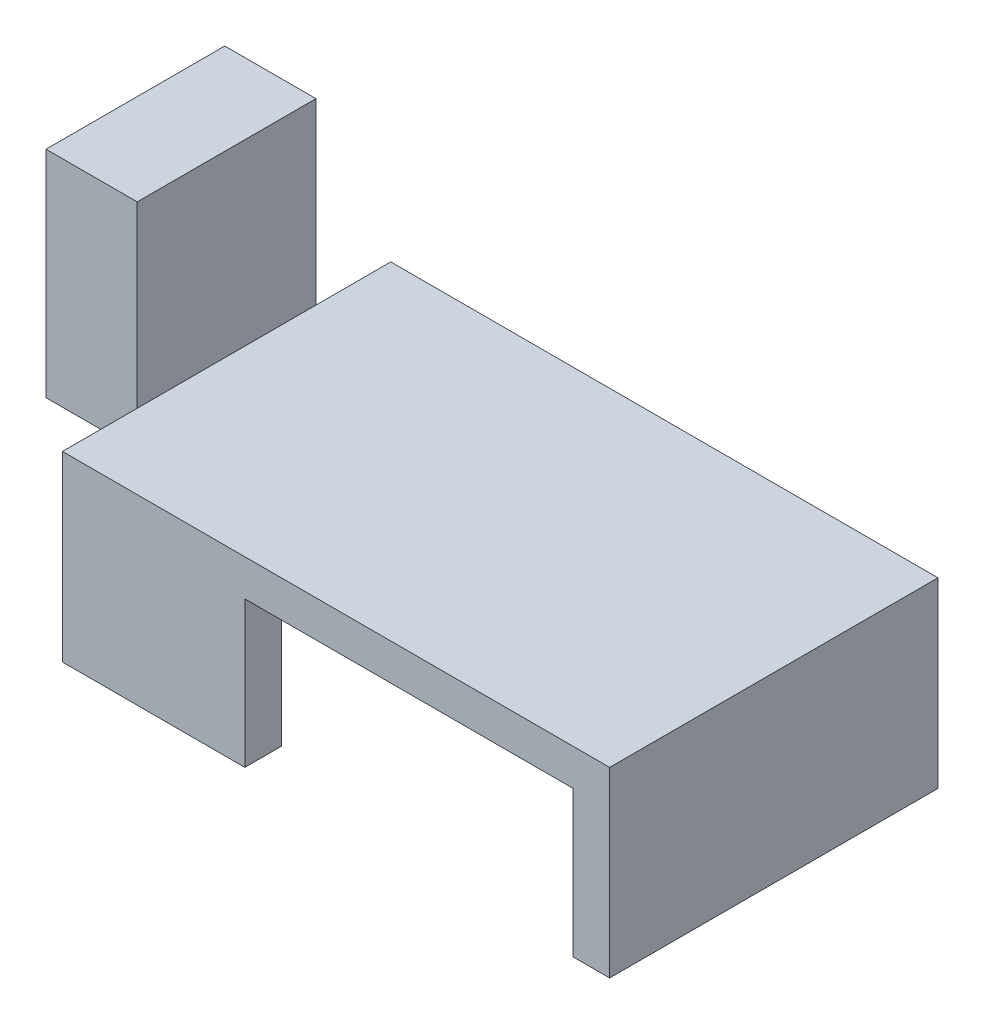
ISO-10303-21;
HEADER;
FILE_DESCRIPTION(('STEP AP214'),'2;1');
FILE_NAME('part.step','',(''),(''),'','','');
FILE_SCHEMA(('AUTOMOTIVE_DESIGN { 1 0 10303 214 1 1 1 1 }'));
ENDSEC;
DATA;
#1=APPLICATION_CONTEXT('core data for automotive mechanical design processes');
#2=APPLICATION_PROTOCOL_DEFINITION('international standard','automotive_design',2000,#1);
#3=PRODUCT_CONTEXT('',#1,'mechanical');
#4=PRODUCT('Part','Part','',(#3));
#5=PRODUCT_RELATED_PRODUCT_CATEGORY('part','',(#4));
#6=PRODUCT_DEFINITION_FORMATION('','',#4);
#7=PRODUCT_DEFINITION_CONTEXT('part definition',#1,'design');
#8=PRODUCT_DEFINITION('design','',#6,#7);
#9=PRODUCT_DEFINITION_SHAPE('','',#8);
#10=(LENGTH_UNIT() NAMED_UNIT(*) SI_UNIT(.MILLI.,.METRE.));
#11=(NAMED_UNIT(*) PLANE_ANGLE_UNIT() SI_UNIT($,.RADIAN.));
#12=(NAMED_UNIT(*) SI_UNIT($,.STERADIAN.) SOLID_ANGLE_UNIT());
#13=UNCERTAINTY_MEASURE_WITH_UNIT(LENGTH_MEASURE(1.E-05),#10,'distance_accuracy_value','');
#14=(GEOMETRIC_REPRESENTATION_CONTEXT(3) GLOBAL_UNCERTAINTY_ASSIGNED_CONTEXT((#13)) GLOBAL_UNIT_ASSIGNED_CONTEXT((#10,
#11,#12)) REPRESENTATION_CONTEXT('',''));
#15=CARTESIAN_POINT('',(0.,0.,0.));
#16=DIRECTION('',(0.,0.,1.));
#17=DIRECTION('',(1.,0.,0.));
#18=AXIS2_PLACEMENT_3D('',#15,#16,#17);
#19=CARTESIAN_POINT('',(9.00000000000001,-8.,-7.));
#20=DIRECTION('',(0.,0.,-1.));
#21=DIRECTION('',(-1.,0.,0.));
#22=AXIS2_PLACEMENT_3D('',#19,#20,#21);
#23=PLANE('',#22);
#24=DIRECTION('',(0.,-1.,0.));
#25=VECTOR('',#24,1.);
#26=CARTESIAN_POINT('',(1.,-8.,-6.99999999999999));
#27=LINE('',#26,#25);
#28=CARTESIAN_POINT('',(1.,0.,-6.99999999999999));
#29=VERTEX_POINT('',#28);
#30=CARTESIAN_POINT('',(1.,-8.,-7.));
#31=VERTEX_POINT('',#30);
#32=EDGE_CURVE('E54',#29,#31,#27,.T.);
#33=ORIENTED_EDGE('',*,*,#32,.F.);
#34=DIRECTION('',(-1.,0.,0.));
#35=VECTOR('',#34,1.);
#36=CARTESIAN_POINT('',(9.00000000000001,0.,-7.));
#37=LINE('',#36,#35);
#38=CARTESIAN_POINT('',(-9.,0.,-7.));
#39=VERTEX_POINT('',#38);
#40=EDGE_CURVE('E175',#29,#39,#37,.T.);
#41=ORIENTED_EDGE('',*,*,#40,.T.);
#42=DIRECTION('',(0.,1.,0.));
#43=VECTOR('',#42,1.);
#44=CARTESIAN_POINT('',(-9.,0.,-7.));
#45=LINE('',#44,#43);
#46=CARTESIAN_POINT('',(-9.,-8.,-7.));
#47=VERTEX_POINT('',#46);
#48=EDGE_CURVE('E197',#47,#39,#45,.T.);
#49=ORIENTED_EDGE('',*,*,#48,.F.);
#50=DIRECTION('',(-1.,0.,0.));
#51=VECTOR('',#50,1.);
#52=CARTESIAN_POINT('',(9.00000000000001,-8.,-7.));
#53=LINE('',#52,#51);
#54=EDGE_CURVE('E278',#31,#47,#53,.T.);
#55=ORIENTED_EDGE('',*,*,#54,.F.);
#56=EDGE_LOOP('',(#33,#41,#49,#55));
#57=FACE_BOUND('',#56,.T.);
#58=ADVANCED_FACE('F39',(#57),#23,.F.);
#59=CARTESIAN_POINT('',(0.,-8.,0.));
#60=DIRECTION('',(0.,-1.,0.));
#61=DIRECTION('',(0.,0.,-1.));
#62=AXIS2_PLACEMENT_3D('',#59,#60,#61);
#63=PLANE('',#62);
#64=DIRECTION('',(1.,0.,0.));
#65=VECTOR('',#64,1.);
#66=CARTESIAN_POINT('',(9.,-8.,-9.));
#67=LINE('',#66,#65);
#68=CARTESIAN_POINT('',(-9.,-8.,-9.));
#69=VERTEX_POINT('',#68);
#70=CARTESIAN_POINT('',(1.,-8.,-8.99999999999999));
#71=VERTEX_POINT('',#70);
#72=EDGE_CURVE('E168',#69,#71,#67,.T.);
#73=ORIENTED_EDGE('',*,*,#72,.T.);
#74=DIRECTION('',(0.,0.,-1.));
#75=VECTOR('',#74,1.);
#76=CARTESIAN_POINT('',(1.,-8.,-8.99999999999999));
#77=LINE('',#76,#75);
#78=EDGE_CURVE('E178',#31,#71,#77,.T.);
#79=ORIENTED_EDGE('',*,*,#78,.F.);
#80=ORIENTED_EDGE('',*,*,#54,.T.);
#81=DIRECTION('',(0.,0.,1.));
#82=VECTOR('',#81,1.);
#83=CARTESIAN_POINT('',(-9.,-8.,-9.));
#84=LINE('',#83,#82);
#85=EDGE_CURVE('E194',#69,#47,#84,.T.);
#86=ORIENTED_EDGE('',*,*,#85,.F.);
#87=EDGE_LOOP('',(#73,#79,#80,#86));
#88=FACE_BOUND('',#87,.T.);
#89=ADVANCED_FACE('F311',(#88),#63,.T.);
#90=CARTESIAN_POINT('',(-9.,-8.,7.));
#91=DIRECTION('',(0.,0.,1.));
#92=DIRECTION('',(1.,0.,0.));
#93=AXIS2_PLACEMENT_3D('',#90,#91,#92);
#94=PLANE('',#93);
#95=DIRECTION('',(0.,1.,0.));
#96=VECTOR('',#95,1.);
#97=CARTESIAN_POINT('',(1.,-8.,7.));
#98=LINE('',#97,#96);
#99=CARTESIAN_POINT('',(1.,-8.,7.));
#100=VERTEX_POINT('',#99);
#101=CARTESIAN_POINT('',(1.,0.,7.));
#102=VERTEX_POINT('',#101);
#103=EDGE_CURVE('E179',#100,#102,#98,.T.);
#104=ORIENTED_EDGE('',*,*,#103,.F.);
#105=DIRECTION('',(1.,0.,0.));
#106=VECTOR('',#105,1.);
#107=CARTESIAN_POINT('',(-9.,-8.,7.));
#108=LINE('',#107,#106);
#109=CARTESIAN_POINT('',(-9.,-8.,7.));
#110=VERTEX_POINT('',#109);
#111=EDGE_CURVE('E268',#110,#100,#108,.T.);
#112=ORIENTED_EDGE('',*,*,#111,.F.);
#113=DIRECTION('',(0.,-1.,0.));
#114=VECTOR('',#113,1.);
#115=CARTESIAN_POINT('',(-9.,-8.,7.));
#116=LINE('',#115,#114);
#117=CARTESIAN_POINT('',(-9.,0.,7.));
#118=VERTEX_POINT('',#117);
#119=EDGE_CURVE('E198',#118,#110,#116,.T.);
#120=ORIENTED_EDGE('',*,*,#119,.F.);
#121=DIRECTION('',(1.,0.,0.));
#122=VECTOR('',#121,1.);
#123=CARTESIAN_POINT('',(-9.,0.,7.));
#124=LINE('',#123,#122);
#125=EDGE_CURVE('E62',#118,#102,#124,.T.);
#126=ORIENTED_EDGE('',*,*,#125,.T.);
#127=EDGE_LOOP('',(#104,#112,#120,#126));
#128=FACE_BOUND('',#127,.T.);
#129=ADVANCED_FACE('F309',(#128),#94,.F.);
#130=CARTESIAN_POINT('',(0.,-8.,0.));
#131=DIRECTION('',(0.,-1.,0.));
#132=DIRECTION('',(0.,0.,-1.));
#133=AXIS2_PLACEMENT_3D('',#130,#131,#132);
#134=PLANE('',#133);
#135=ORIENTED_EDGE('',*,*,#111,.T.);
#136=DIRECTION('',(0.,0.,-1.));
#137=VECTOR('',#136,1.);
#138=CARTESIAN_POINT('',(1.,-8.,7.));
#139=LINE('',#138,#137);
#140=CARTESIAN_POINT('',(1.,-8.,9.00000000000001));
#141=VERTEX_POINT('',#140);
#142=EDGE_CURVE('E188',#141,#100,#139,.T.);
#143=ORIENTED_EDGE('',*,*,#142,.F.);
#144=DIRECTION('',(-1.,0.,0.));
#145=VECTOR('',#144,1.);
#146=CARTESIAN_POINT('',(-9.,-8.,9.));
#147=LINE('',#146,#145);
#148=CARTESIAN_POINT('',(-9.,-8.,9.));
#149=VERTEX_POINT('',#148);
#150=EDGE_CURVE('E271',#141,#149,#147,.T.);
#151=ORIENTED_EDGE('',*,*,#150,.T.);
#152=DIRECTION('',(0.,0.,1.));
#153=VECTOR('',#152,1.);
#154=CARTESIAN_POINT('',(-9.,-8.,9.));
#155=LINE('',#154,#153);
#156=EDGE_CURVE('E187',#110,#149,#155,.T.);
#157=ORIENTED_EDGE('',*,*,#156,.F.);
#158=EDGE_LOOP('',(#135,#143,#151,#157));
#159=FACE_BOUND('',#158,.T.);
#160=ADVANCED_FACE('F303',(#159),#134,.T.);
#161=CARTESIAN_POINT('',(0.,0.,0.));
#162=DIRECTION('',(0.,1.,0.));
#163=DIRECTION('',(0.,0.,1.));
#164=AXIS2_PLACEMENT_3D('',#161,#162,#163);
#165=PLANE('',#164);
#166=DIRECTION('',(0.,0.,1.));
#167=VECTOR('',#166,1.);
#168=CARTESIAN_POINT('',(1.,0.,-8.99999999999999));
#169=LINE('',#168,#167);
#170=CARTESIAN_POINT('',(1.,0.,-8.99999999999999));
#171=VERTEX_POINT('',#170);
#172=EDGE_CURVE('E172',#171,#29,#169,.T.);
#173=ORIENTED_EDGE('',*,*,#172,.F.);
#174=DIRECTION('',(-1.,0.,0.));
#175=VECTOR('',#174,1.);
#176=CARTESIAN_POINT('',(21.,0.,-9.));
#177=LINE('',#176,#175);
#178=CARTESIAN_POINT('',(19.,0.,-9.));
#179=VERTEX_POINT('',#178);
#180=EDGE_CURVE('E159',#179,#171,#177,.T.);
#181=ORIENTED_EDGE('',*,*,#180,.F.);
#182=DIRECTION('',(0.,0.,-1.));
#183=VECTOR('',#182,1.);
#184=CARTESIAN_POINT('',(19.,0.,7.));
#185=LINE('',#184,#183);
#186=CARTESIAN_POINT('',(19.,0.,9.));
#187=VERTEX_POINT('',#186);
#188=EDGE_CURVE('E249',#187,#179,#185,.T.);
#189=ORIENTED_EDGE('',*,*,#188,.F.);
#190=DIRECTION('',(1.,0.,0.));
#191=VECTOR('',#190,1.);
#192=CARTESIAN_POINT('',(-9.,0.,9.));
#193=LINE('',#192,#191);
#194=CARTESIAN_POINT('',(1.,0.,9.00000000000001));
#195=VERTEX_POINT('',#194);
#196=EDGE_CURVE('E208',#195,#187,#193,.T.);
#197=ORIENTED_EDGE('',*,*,#196,.F.);
#198=DIRECTION('',(0.,0.,1.));
#199=VECTOR('',#198,1.);
#200=CARTESIAN_POINT('',(1.,0.,7.));
#201=LINE('',#200,#199);
#202=EDGE_CURVE('E182',#102,#195,#201,.T.);
#203=ORIENTED_EDGE('',*,*,#202,.F.);
#204=ORIENTED_EDGE('',*,*,#125,.F.);
#205=DIRECTION('',(0.,0.,1.));
#206=VECTOR('',#205,1.);
#207=CARTESIAN_POINT('',(-9.,0.,-9.));
#208=LINE('',#207,#206);
#209=CARTESIAN_POINT('',(-9.,0.,4.9));
#210=VERTEX_POINT('',#209);
#211=EDGE_CURVE('E275',#210,#118,#208,.T.);
#212=ORIENTED_EDGE('',*,*,#211,.F.);
#213=DIRECTION('',(1.,0.,0.));
#214=VECTOR('',#213,1.);
#215=CARTESIAN_POINT('',(-14.,0.,4.9));
#216=LINE('',#215,#214);
#217=CARTESIAN_POINT('',(-14.,0.,4.9));
#218=VERTEX_POINT('',#217);
#219=EDGE_CURVE('E239',#218,#210,#216,.T.);
#220=ORIENTED_EDGE('',*,*,#219,.F.);
#221=DIRECTION('',(0.,0.,1.));
#222=VECTOR('',#221,1.);
#223=CARTESIAN_POINT('',(-14.,0.,-4.9));
#224=LINE('',#223,#222);
#225=CARTESIAN_POINT('',(-14.,0.,-4.9));
#226=VERTEX_POINT('',#225);
#227=EDGE_CURVE('E234',#226,#218,#224,.T.);
#228=ORIENTED_EDGE('',*,*,#227,.F.);
#229=DIRECTION('',(1.,0.,0.));
#230=VECTOR('',#229,1.);
#231=CARTESIAN_POINT('',(-14.,0.,-4.9));
#232=LINE('',#231,#230);
#233=CARTESIAN_POINT('',(-9.,0.,-4.9));
#234=VERTEX_POINT('',#233);
#235=EDGE_CURVE('E246',#226,#234,#232,.T.);
#236=ORIENTED_EDGE('',*,*,#235,.T.);
#237=EDGE_CURVE('E284',#39,#234,#208,.T.);
#238=ORIENTED_EDGE('',*,*,#237,.F.);
#239=ORIENTED_EDGE('',*,*,#40,.F.);
#240=EDGE_LOOP('',(#173,#181,#189,#197,#203,#204,#212,#220,#228,#236,#238,#239));
#241=FACE_BOUND('',#240,.T.);
#242=ADVANCED_FACE('F173',(#241),#165,.F.);
#243=CARTESIAN_POINT('',(21.,-8.,9.));
#244=VERTEX_POINT('',#243);
#245=CARTESIAN_POINT('',(19.,-8.,9.));
#246=VERTEX_POINT('',#245);
#247=EDGE_CURVE('E272',#244,#246,#147,.T.);
#248=ORIENTED_EDGE('',*,*,#247,.T.);
#249=DIRECTION('',(0.,0.,-1.));
#250=VECTOR('',#249,1.);
#251=CARTESIAN_POINT('',(19.,-8.,7.));
#252=LINE('',#251,#250);
#253=CARTESIAN_POINT('',(19.,-8.,-9.));
#254=VERTEX_POINT('',#253);
#255=EDGE_CURVE('E253',#246,#254,#252,.T.);
#256=ORIENTED_EDGE('',*,*,#255,.T.);
#257=DIRECTION('',(1.,0.,0.));
#258=VECTOR('',#257,1.);
#259=CARTESIAN_POINT('',(21.,-8.,-9.));
#260=LINE('',#259,#258);
#261=CARTESIAN_POINT('',(21.,-8.,-9.));
#262=VERTEX_POINT('',#261);
#263=EDGE_CURVE('E255',#254,#262,#260,.T.);
#264=ORIENTED_EDGE('',*,*,#263,.T.);
#265=DIRECTION('',(0.,0.,1.));
#266=VECTOR('',#265,1.);
#267=CARTESIAN_POINT('',(21.,-8.,9.));
#268=LINE('',#267,#266);
#269=EDGE_CURVE('E250',#262,#244,#268,.T.);
#270=ORIENTED_EDGE('',*,*,#269,.T.);
#271=EDGE_LOOP('',(#248,#256,#264,#270));
#272=FACE_BOUND('',#271,.T.);
#273=ADVANCED_FACE('F318',(#272),#134,.T.);
#274=CARTESIAN_POINT('',(-9.,2.,-9.));
#275=DIRECTION('',(1.,0.,0.));
#276=DIRECTION('',(0.,0.,-1.));
#277=AXIS2_PLACEMENT_3D('',#274,#275,#276);
#278=PLANE('',#277);
#279=DIRECTION('',(0.,-1.,0.));
#280=VECTOR('',#279,1.);
#281=CARTESIAN_POINT('',(-9.,2.,-9.));
#282=LINE('',#281,#280);
#283=CARTESIAN_POINT('',(-9.,2.,-9.));
#284=VERTEX_POINT('',#283);
#285=EDGE_CURVE('E11',#284,#69,#282,.T.);
#286=ORIENTED_EDGE('',*,*,#285,.T.);
#287=ORIENTED_EDGE('',*,*,#85,.T.);
#288=ORIENTED_EDGE('',*,*,#48,.T.);
#289=ORIENTED_EDGE('',*,*,#237,.T.);
#290=DIRECTION('',(0.,-1.,0.));
#291=VECTOR('',#290,1.);
#292=CARTESIAN_POINT('',(-9.,2.,-4.9));
#293=LINE('',#292,#291);
#294=CARTESIAN_POINT('',(-9.,2.,-4.9));
#295=VERTEX_POINT('',#294);
#296=EDGE_CURVE('E230',#295,#234,#293,.T.);
#297=ORIENTED_EDGE('',*,*,#296,.F.);
#298=DIRECTION('',(0.,0.,1.));
#299=VECTOR('',#298,1.);
#300=CARTESIAN_POINT('',(-9.,2.,-9.));
#301=LINE('',#300,#299);
#302=EDGE_CURVE('E285',#284,#295,#301,.T.);
#303=ORIENTED_EDGE('',*,*,#302,.F.);
#304=EDGE_LOOP('',(#286,#287,#288,#289,#297,#303));
#305=FACE_BOUND('',#304,.T.);
#306=ADVANCED_FACE('F336',(#305),#278,.F.);
#307=ORIENTED_EDGE('',*,*,#211,.T.);
#308=ORIENTED_EDGE('',*,*,#119,.T.);
#309=ORIENTED_EDGE('',*,*,#156,.T.);
#310=DIRECTION('',(0.,-1.,0.));
#311=VECTOR('',#310,1.);
#312=CARTESIAN_POINT('',(-9.,2.,9.));
#313=LINE('',#312,#311);
#314=CARTESIAN_POINT('',(-9.,2.,9.));
#315=VERTEX_POINT('',#314);
#316=EDGE_CURVE('E47',#315,#149,#313,.T.);
#317=ORIENTED_EDGE('',*,*,#316,.F.);
#318=CARTESIAN_POINT('',(-9.,2.,4.9));
#319=VERTEX_POINT('',#318);
#320=EDGE_CURVE('E283',#319,#315,#301,.T.);
#321=ORIENTED_EDGE('',*,*,#320,.F.);
#322=DIRECTION('',(0.,1.,0.));
#323=VECTOR('',#322,1.);
#324=CARTESIAN_POINT('',(-9.,2.,4.9));
#325=LINE('',#324,#323);
#326=EDGE_CURVE('E235',#210,#319,#325,.T.);
#327=ORIENTED_EDGE('',*,*,#326,.F.);
#328=EDGE_LOOP('',(#307,#308,#309,#317,#321,#327));
#329=FACE_BOUND('',#328,.T.);
#330=ADVANCED_FACE('F300',(#329),#278,.F.);
#331=CARTESIAN_POINT('',(-9.,2.,-9.));
#332=DIRECTION('',(0.,0.,1.));
#333=DIRECTION('',(1.,0.,0.));
#334=AXIS2_PLACEMENT_3D('',#331,#332,#333);
#335=PLANE('',#334);
#336=ORIENTED_EDGE('',*,*,#180,.T.);
#337=DIRECTION('',(0.,1.,0.));
#338=VECTOR('',#337,1.);
#339=CARTESIAN_POINT('',(1.,-8.,-8.99999999999999));
#340=LINE('',#339,#338);
#341=EDGE_CURVE('E163',#71,#171,#340,.T.);
#342=ORIENTED_EDGE('',*,*,#341,.F.);
#343=ORIENTED_EDGE('',*,*,#72,.F.);
#344=ORIENTED_EDGE('',*,*,#285,.F.);
#345=DIRECTION('',(-1.,0.,0.));
#346=VECTOR('',#345,1.);
#347=CARTESIAN_POINT('',(-9.,2.,-9.));
#348=LINE('',#347,#346);
#349=CARTESIAN_POINT('',(21.,2.,-9.));
#350=VERTEX_POINT('',#349);
#351=EDGE_CURVE('E281',#350,#284,#348,.T.);
#352=ORIENTED_EDGE('',*,*,#351,.F.);
#353=DIRECTION('',(0.,1.,0.));
#354=VECTOR('',#353,1.);
#355=CARTESIAN_POINT('',(21.,2.,-9.));
#356=LINE('',#355,#354);
#357=EDGE_CURVE('E263',#262,#350,#356,.T.);
#358=ORIENTED_EDGE('',*,*,#357,.F.);
#359=ORIENTED_EDGE('',*,*,#263,.F.);
#360=DIRECTION('',(0.,1.,0.));
#361=VECTOR('',#360,1.);
#362=CARTESIAN_POINT('',(19.,-8.,-9.));
#363=LINE('',#362,#361);
#364=EDGE_CURVE('E167',#254,#179,#363,.T.);
#365=ORIENTED_EDGE('',*,*,#364,.T.);
#366=EDGE_LOOP('',(#336,#342,#343,#344,#352,#358,#359,#365));
#367=FACE_BOUND('',#366,.T.);
#368=ADVANCED_FACE('F41',(#367),#335,.F.);
#369=CARTESIAN_POINT('',(-9.,2.,9.));
#370=DIRECTION('',(0.,0.,-1.));
#371=DIRECTION('',(-1.,0.,0.));
#372=AXIS2_PLACEMENT_3D('',#369,#370,#371);
#373=PLANE('',#372);
#374=DIRECTION('',(0.,-1.,0.));
#375=VECTOR('',#374,1.);
#376=CARTESIAN_POINT('',(1.,-8.,9.00000000000001));
#377=LINE('',#376,#375);
#378=EDGE_CURVE('E190',#195,#141,#377,.T.);
#379=ORIENTED_EDGE('',*,*,#378,.F.);
#380=ORIENTED_EDGE('',*,*,#196,.T.);
#381=DIRECTION('',(0.,-1.,0.));
#382=VECTOR('',#381,1.);
#383=CARTESIAN_POINT('',(19.,2.,9.));
#384=LINE('',#383,#382);
#385=EDGE_CURVE('E201',#187,#246,#384,.T.);
#386=ORIENTED_EDGE('',*,*,#385,.T.);
#387=ORIENTED_EDGE('',*,*,#247,.F.);
#388=DIRECTION('',(0.,-1.,0.));
#389=VECTOR('',#388,1.);
#390=CARTESIAN_POINT('',(21.,2.,9.));
#391=LINE('',#390,#389);
#392=CARTESIAN_POINT('',(21.,2.,9.));
#393=VERTEX_POINT('',#392);
#394=EDGE_CURVE('E260',#393,#244,#391,.T.);
#395=ORIENTED_EDGE('',*,*,#394,.F.);
#396=DIRECTION('',(1.,0.,0.));
#397=VECTOR('',#396,1.);
#398=CARTESIAN_POINT('',(-9.,2.,9.));
#399=LINE('',#398,#397);
#400=EDGE_CURVE('E287',#315,#393,#399,.T.);
#401=ORIENTED_EDGE('',*,*,#400,.F.);
#402=ORIENTED_EDGE('',*,*,#316,.T.);
#403=ORIENTED_EDGE('',*,*,#150,.F.);
#404=EDGE_LOOP('',(#379,#380,#386,#387,#395,#401,#402,#403));
#405=FACE_BOUND('',#404,.T.);
#406=ADVANCED_FACE('F295',(#405),#373,.F.);
#407=CARTESIAN_POINT('',(0.,2.,0.));
#408=DIRECTION('',(0.,1.,0.));
#409=DIRECTION('',(0.,0.,1.));
#410=AXIS2_PLACEMENT_3D('',#407,#408,#409);
#411=PLANE('',#410);
#412=DIRECTION('',(0.,0.,-1.));
#413=VECTOR('',#412,1.);
#414=CARTESIAN_POINT('',(-9.,2.,-4.9));
#415=LINE('',#414,#413);
#416=EDGE_CURVE('E211',#319,#295,#415,.T.);
#417=ORIENTED_EDGE('',*,*,#416,.F.);
#418=ORIENTED_EDGE('',*,*,#320,.T.);
#419=ORIENTED_EDGE('',*,*,#400,.T.);
#420=DIRECTION('',(0.,0.,1.));
#421=VECTOR('',#420,1.);
#422=CARTESIAN_POINT('',(21.,2.,9.));
#423=LINE('',#422,#421);
#424=EDGE_CURVE('E169',#350,#393,#423,.T.);
#425=ORIENTED_EDGE('',*,*,#424,.F.);
#426=ORIENTED_EDGE('',*,*,#351,.T.);
#427=ORIENTED_EDGE('',*,*,#302,.T.);
#428=EDGE_LOOP('',(#417,#418,#419,#425,#426,#427));
#429=FACE_BOUND('',#428,.T.);
#430=ADVANCED_FACE('F328',(#429),#411,.T.);
#431=CARTESIAN_POINT('',(21.,0.,0.));
#432=DIRECTION('',(1.,0.,0.));
#433=DIRECTION('',(0.,0.,-1.));
#434=AXIS2_PLACEMENT_3D('',#431,#432,#433);
#435=PLANE('',#434);
#436=ORIENTED_EDGE('',*,*,#394,.T.);
#437=ORIENTED_EDGE('',*,*,#269,.F.);
#438=ORIENTED_EDGE('',*,*,#357,.T.);
#439=ORIENTED_EDGE('',*,*,#424,.T.);
#440=EDGE_LOOP('',(#436,#437,#438,#439));
#441=FACE_BOUND('',#440,.T.);
#442=ADVANCED_FACE('F331',(#441),#435,.T.);
#443=CARTESIAN_POINT('',(19.,-8.,7.));
#444=DIRECTION('',(1.,0.,0.));
#445=DIRECTION('',(0.,0.,-1.));
#446=AXIS2_PLACEMENT_3D('',#443,#444,#445);
#447=PLANE('',#446);
#448=ORIENTED_EDGE('',*,*,#188,.T.);
#449=ORIENTED_EDGE('',*,*,#364,.F.);
#450=ORIENTED_EDGE('',*,*,#255,.F.);
#451=ORIENTED_EDGE('',*,*,#385,.F.);
#452=EDGE_LOOP('',(#448,#449,#450,#451));
#453=FACE_BOUND('',#452,.T.);
#454=ADVANCED_FACE('F385',(#453),#447,.F.);
#455=CARTESIAN_POINT('',(-14.,2.,-4.9));
#456=DIRECTION('',(0.,0.,1.));
#457=DIRECTION('',(1.,0.,0.));
#458=AXIS2_PLACEMENT_3D('',#455,#456,#457);
#459=PLANE('',#458);
#460=ORIENTED_EDGE('',*,*,#296,.T.);
#461=ORIENTED_EDGE('',*,*,#235,.F.);
#462=DIRECTION('',(0.,-1.,0.));
#463=VECTOR('',#462,1.);
#464=CARTESIAN_POINT('',(-14.,2.,-4.9));
#465=LINE('',#464,#463);
#466=CARTESIAN_POINT('',(-14.,11.8,-4.9));
#467=VERTEX_POINT('',#466);
#468=EDGE_CURVE('E231',#467,#226,#465,.T.);
#469=ORIENTED_EDGE('',*,*,#468,.F.);
#470=DIRECTION('',(-1.,0.,0.));
#471=VECTOR('',#470,1.);
#472=CARTESIAN_POINT('',(-14.,11.8,-4.9));
#473=LINE('',#472,#471);
#474=CARTESIAN_POINT('',(-9.,11.8,-4.9));
#475=VERTEX_POINT('',#474);
#476=EDGE_CURVE('E219',#475,#467,#473,.T.);
#477=ORIENTED_EDGE('',*,*,#476,.F.);
#478=DIRECTION('',(0.,-1.,0.));
#479=VECTOR('',#478,1.);
#480=CARTESIAN_POINT('',(-9.,11.8,-4.9));
#481=LINE('',#480,#479);
#482=EDGE_CURVE('E222',#475,#295,#481,.T.);
#483=ORIENTED_EDGE('',*,*,#482,.T.);
#484=EDGE_LOOP('',(#460,#461,#469,#477,#483));
#485=FACE_BOUND('',#484,.T.);
#486=ADVANCED_FACE('F353',(#485),#459,.F.);
#487=CARTESIAN_POINT('',(-14.,2.,4.9));
#488=DIRECTION('',(0.,0.,-1.));
#489=DIRECTION('',(-1.,0.,0.));
#490=AXIS2_PLACEMENT_3D('',#487,#488,#489);
#491=PLANE('',#490);
#492=ORIENTED_EDGE('',*,*,#326,.T.);
#493=DIRECTION('',(0.,-1.,0.));
#494=VECTOR('',#493,1.);
#495=CARTESIAN_POINT('',(-9.,11.8,4.9));
#496=LINE('',#495,#494);
#497=CARTESIAN_POINT('',(-9.,11.8,4.9));
#498=VERTEX_POINT('',#497);
#499=EDGE_CURVE('E227',#498,#319,#496,.T.);
#500=ORIENTED_EDGE('',*,*,#499,.F.);
#501=DIRECTION('',(1.,0.,0.));
#502=VECTOR('',#501,1.);
#503=CARTESIAN_POINT('',(-14.,11.8,4.9));
#504=LINE('',#503,#502);
#505=CARTESIAN_POINT('',(-14.,11.8,4.9));
#506=VERTEX_POINT('',#505);
#507=EDGE_CURVE('E215',#506,#498,#504,.T.);
#508=ORIENTED_EDGE('',*,*,#507,.F.);
#509=DIRECTION('',(0.,1.,0.));
#510=VECTOR('',#509,1.);
#511=CARTESIAN_POINT('',(-14.,2.,4.9));
#512=LINE('',#511,#510);
#513=EDGE_CURVE('E237',#218,#506,#512,.T.);
#514=ORIENTED_EDGE('',*,*,#513,.F.);
#515=ORIENTED_EDGE('',*,*,#219,.T.);
#516=EDGE_LOOP('',(#492,#500,#508,#514,#515));
#517=FACE_BOUND('',#516,.T.);
#518=ADVANCED_FACE('F361',(#517),#491,.F.);
#519=CARTESIAN_POINT('',(-14.,0.,0.));
#520=DIRECTION('',(-1.,0.,0.));
#521=DIRECTION('',(0.,0.,1.));
#522=AXIS2_PLACEMENT_3D('',#519,#520,#521);
#523=PLANE('',#522);
#524=ORIENTED_EDGE('',*,*,#468,.T.);
#525=ORIENTED_EDGE('',*,*,#227,.T.);
#526=ORIENTED_EDGE('',*,*,#513,.T.);
#527=DIRECTION('',(0.,0.,1.));
#528=VECTOR('',#527,1.);
#529=CARTESIAN_POINT('',(-14.,11.8,-4.9));
#530=LINE('',#529,#528);
#531=EDGE_CURVE('E212',#467,#506,#530,.T.);
#532=ORIENTED_EDGE('',*,*,#531,.F.);
#533=EDGE_LOOP('',(#524,#525,#526,#532));
#534=FACE_BOUND('',#533,.T.);
#535=ADVANCED_FACE('F366',(#534),#523,.T.);
#536=CARTESIAN_POINT('',(-9.,11.8,-4.9));
#537=DIRECTION('',(-1.,0.,0.));
#538=DIRECTION('',(0.,0.,1.));
#539=AXIS2_PLACEMENT_3D('',#536,#537,#538);
#540=PLANE('',#539);
#541=ORIENTED_EDGE('',*,*,#416,.T.);
#542=ORIENTED_EDGE('',*,*,#482,.F.);
#543=DIRECTION('',(0.,0.,-1.));
#544=VECTOR('',#543,1.);
#545=CARTESIAN_POINT('',(-9.,11.8,-4.9));
#546=LINE('',#545,#544);
#547=EDGE_CURVE('E217',#498,#475,#546,.T.);
#548=ORIENTED_EDGE('',*,*,#547,.F.);
#549=ORIENTED_EDGE('',*,*,#499,.T.);
#550=EDGE_LOOP('',(#541,#542,#548,#549));
#551=FACE_BOUND('',#550,.T.);
#552=ADVANCED_FACE('F358',(#551),#540,.F.);
#553=CARTESIAN_POINT('',(0.,11.8,0.));
#554=DIRECTION('',(0.,1.,0.));
#555=DIRECTION('',(0.,0.,1.));
#556=AXIS2_PLACEMENT_3D('',#553,#554,#555);
#557=PLANE('',#556);
#558=ORIENTED_EDGE('',*,*,#531,.T.);
#559=ORIENTED_EDGE('',*,*,#507,.T.);
#560=ORIENTED_EDGE('',*,*,#547,.T.);
#561=ORIENTED_EDGE('',*,*,#476,.T.);
#562=EDGE_LOOP('',(#558,#559,#560,#561));
#563=FACE_BOUND('',#562,.T.);
#564=ADVANCED_FACE('F368',(#563),#557,.T.);
#565=CARTESIAN_POINT('',(1.,0.,0.));
#566=DIRECTION('',(1.,0.,0.));
#567=DIRECTION('',(0.,0.,-1.));
#568=AXIS2_PLACEMENT_3D('',#565,#566,#567);
#569=PLANE('',#568);
#570=ORIENTED_EDGE('',*,*,#103,.T.);
#571=ORIENTED_EDGE('',*,*,#202,.T.);
#572=ORIENTED_EDGE('',*,*,#378,.T.);
#573=ORIENTED_EDGE('',*,*,#142,.T.);
#574=EDGE_LOOP('',(#570,#571,#572,#573));
#575=FACE_BOUND('',#574,.T.);
#576=ADVANCED_FACE('F307',(#575),#569,.T.);
#577=CARTESIAN_POINT('',(1.,0.,0.));
#578=DIRECTION('',(1.,0.,0.));
#579=DIRECTION('',(0.,0.,-1.));
#580=AXIS2_PLACEMENT_3D('',#577,#578,#579);
#581=PLANE('',#580);
#582=ORIENTED_EDGE('',*,*,#341,.T.);
#583=ORIENTED_EDGE('',*,*,#172,.T.);
#584=ORIENTED_EDGE('',*,*,#32,.T.);
#585=ORIENTED_EDGE('',*,*,#78,.T.);
#586=EDGE_LOOP('',(#582,#583,#584,#585));
#587=FACE_BOUND('',#586,.T.);
#588=ADVANCED_FACE('F177',(#587),#581,.T.);
#589=CLOSED_SHELL('',(#58,#89,#129,#160,#242,#273,#306,#330,#368,#406,#430,#442,#454,#486,#518,
#535,#552,#564,#576,#588));
#590=MANIFOLD_SOLID_BREP('B2',#589);
#591=ADVANCED_BREP_SHAPE_REPRESENTATION('',(#18,#590),#14);
#592=SHAPE_DEFINITION_REPRESENTATION(#9,#591);
ENDSEC;
END-ISO-10303-21;
